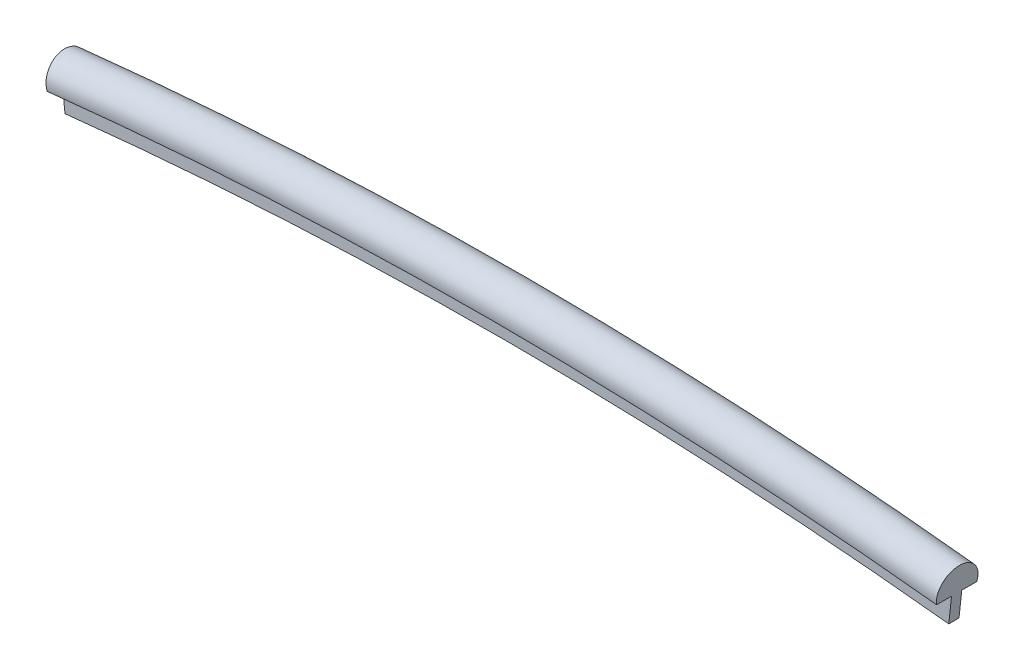
ISO-10303-21;
HEADER;
FILE_DESCRIPTION(('STEP AP214'),'2;1');
FILE_NAME('part.step','',(''),(''),'','','');
FILE_SCHEMA(('AUTOMOTIVE_DESIGN { 1 0 10303 214 1 1 1 1 }'));
ENDSEC;
DATA;
#1=APPLICATION_CONTEXT('core data for automotive mechanical design processes');
#2=APPLICATION_PROTOCOL_DEFINITION('international standard','automotive_design',2000,#1);
#3=PRODUCT_CONTEXT('',#1,'mechanical');
#4=PRODUCT('Part','Part','',(#3));
#5=PRODUCT_RELATED_PRODUCT_CATEGORY('part','',(#4));
#6=PRODUCT_DEFINITION_FORMATION('','',#4);
#7=PRODUCT_DEFINITION_CONTEXT('part definition',#1,'design');
#8=PRODUCT_DEFINITION('design','',#6,#7);
#9=PRODUCT_DEFINITION_SHAPE('','',#8);
#10=(LENGTH_UNIT() NAMED_UNIT(*) SI_UNIT(.MILLI.,.METRE.));
#11=(NAMED_UNIT(*) PLANE_ANGLE_UNIT() SI_UNIT($,.RADIAN.));
#12=(NAMED_UNIT(*) SI_UNIT($,.STERADIAN.) SOLID_ANGLE_UNIT());
#13=UNCERTAINTY_MEASURE_WITH_UNIT(LENGTH_MEASURE(1.E-05),#10,'distance_accuracy_value','');
#14=(GEOMETRIC_REPRESENTATION_CONTEXT(3) GLOBAL_UNCERTAINTY_ASSIGNED_CONTEXT((#13)) GLOBAL_UNIT_ASSIGNED_CONTEXT((#10,
#11,#12)) REPRESENTATION_CONTEXT('',''));
#15=CARTESIAN_POINT('',(0.,0.,0.));
#16=DIRECTION('',(0.,0.,1.));
#17=DIRECTION('',(1.,0.,0.));
#18=AXIS2_PLACEMENT_3D('',#15,#16,#17);
#19=CARTESIAN_POINT('',(0.,0.,70.5976415970385));
#20=DIRECTION('',(0.,0.,1.));
#21=DIRECTION('',(1.,0.,0.));
#22=AXIS2_PLACEMENT_3D('',#19,#20,#21);
#23=CYLINDRICAL_SURFACE('',#22,241.3);
#24=CARTESIAN_POINT('',(0.,0.,1.18));
#25=DIRECTION('',(0.,0.,1.));
#26=DIRECTION('',(1.,0.,0.));
#27=AXIS2_PLACEMENT_3D('',#24,#25,#26);
#28=CIRCLE('',#27,241.3);
#29=CARTESIAN_POINT('',(26.0690420080818,239.887671731544,1.18));
#30=VERTEX_POINT('',#29);
#31=CARTESIAN_POINT('',(-26.0690420080818,239.887671731544,1.18));
#32=VERTEX_POINT('',#31);
#33=EDGE_CURVE('E11',#30,#32,#28,.T.);
#34=ORIENTED_EDGE('',*,*,#33,.T.);
#35=DIRECTION('',(0.,0.,-1.));
#36=VECTOR('',#35,1.);
#37=CARTESIAN_POINT('',(-26.0690420080818,239.887671731544,1.18));
#38=LINE('',#37,#36);
#39=CARTESIAN_POINT('',(-26.0690420080818,239.887671731544,0.3));
#40=VERTEX_POINT('',#39);
#41=EDGE_CURVE('E103',#32,#40,#38,.T.);
#42=ORIENTED_EDGE('',*,*,#41,.T.);
#43=CARTESIAN_POINT('',(0.,0.,0.299999999999995));
#44=DIRECTION('',(0.,0.,1.));
#45=DIRECTION('',(1.,0.,0.));
#46=AXIS2_PLACEMENT_3D('',#43,#44,#45);
#47=CIRCLE('',#46,241.3);
#48=CARTESIAN_POINT('',(26.0690420080818,239.887671731544,0.3));
#49=VERTEX_POINT('',#48);
#50=EDGE_CURVE('E85',#49,#40,#47,.T.);
#51=ORIENTED_EDGE('',*,*,#50,.F.);
#52=DIRECTION('',(0.,0.,-1.));
#53=VECTOR('',#52,1.);
#54=CARTESIAN_POINT('',(26.0690420080818,239.887671731544,1.18));
#55=LINE('',#54,#53);
#56=EDGE_CURVE('E117',#30,#49,#55,.T.);
#57=ORIENTED_EDGE('',*,*,#56,.F.);
#58=EDGE_LOOP('',(#34,#42,#51,#57));
#59=FACE_BOUND('',#58,.T.);
#60=ADVANCED_FACE('F33',(#59),#23,.F.);
#61=CARTESIAN_POINT('',(0.,0.,0.));
#62=DIRECTION('',(0.,0.,1.));
#63=DIRECTION('',(1.,0.,0.));
#64=AXIS2_PLACEMENT_3D('',#61,#62,#63);
#65=TOROIDAL_SURFACE('',#64,241.586013989906,1.21416802890791);
#66=CARTESIAN_POINT('',(0.,0.,-1.18));
#67=DIRECTION('',(0.,0.,1.));
#68=DIRECTION('',(1.,0.,0.));
#69=AXIS2_PLACEMENT_3D('',#66,#67,#68);
#70=CIRCLE('',#69,241.3);
#71=CARTESIAN_POINT('',(26.0690420080818,239.887671731544,-1.18));
#72=VERTEX_POINT('',#71);
#73=CARTESIAN_POINT('',(-26.0690420080818,239.887671731544,-1.18));
#74=VERTEX_POINT('',#73);
#75=EDGE_CURVE('E41',#72,#74,#70,.T.);
#76=ORIENTED_EDGE('',*,*,#75,.T.);
#77=CARTESIAN_POINT('',(-26.0999417624032,240.172011682316,0.));
#78=DIRECTION('',(0.994147002617255,0.10803581437249,0.));
#79=DIRECTION('',(0.,0.,1.));
#80=AXIS2_PLACEMENT_3D('',#77,#78,#79);
#81=CIRCLE('',#80,1.21416802890791);
#82=EDGE_CURVE('E115',#74,#32,#81,.T.);
#83=ORIENTED_EDGE('',*,*,#82,.T.);
#84=ORIENTED_EDGE('',*,*,#33,.F.);
#85=CARTESIAN_POINT('',(26.0999417624032,240.172011682316,0.));
#86=DIRECTION('',(0.994147002617255,-0.10803581437249,0.));
#87=DIRECTION('',(0.,0.,1.));
#88=AXIS2_PLACEMENT_3D('',#85,#86,#87);
#89=CIRCLE('',#88,1.21416802890791);
#90=EDGE_CURVE('E97',#72,#30,#89,.T.);
#91=ORIENTED_EDGE('',*,*,#90,.F.);
#92=EDGE_LOOP('',(#76,#83,#84,#91));
#93=FACE_BOUND('',#92,.T.);
#94=ADVANCED_FACE('F35',(#93),#65,.T.);
#95=CARTESIAN_POINT('',(0.,0.,70.5976415970385));
#96=DIRECTION('',(0.,0.,1.));
#97=DIRECTION('',(1.,0.,0.));
#98=AXIS2_PLACEMENT_3D('',#95,#96,#97);
#99=CYLINDRICAL_SURFACE('',#98,241.3);
#100=CARTESIAN_POINT('',(0.,0.,-0.299999999999995));
#101=DIRECTION('',(0.,0.,1.));
#102=DIRECTION('',(1.,0.,0.));
#103=AXIS2_PLACEMENT_3D('',#100,#101,#102);
#104=CIRCLE('',#103,241.3);
#105=CARTESIAN_POINT('',(26.0690420080818,239.887671731544,-0.3));
#106=VERTEX_POINT('',#105);
#107=CARTESIAN_POINT('',(-26.0690420080818,239.887671731544,-0.3));
#108=VERTEX_POINT('',#107);
#109=EDGE_CURVE('E132',#106,#108,#104,.T.);
#110=ORIENTED_EDGE('',*,*,#109,.T.);
#111=DIRECTION('',(0.,0.,-1.));
#112=VECTOR('',#111,1.);
#113=CARTESIAN_POINT('',(-26.0690420080818,239.887671731544,-0.3));
#114=LINE('',#113,#112);
#115=EDGE_CURVE('E113',#108,#74,#114,.T.);
#116=ORIENTED_EDGE('',*,*,#115,.T.);
#117=ORIENTED_EDGE('',*,*,#75,.F.);
#118=DIRECTION('',(0.,0.,-1.));
#119=VECTOR('',#118,1.);
#120=CARTESIAN_POINT('',(26.0690420080818,239.887671731544,-0.3));
#121=LINE('',#120,#119);
#122=EDGE_CURVE('E125',#106,#72,#121,.T.);
#123=ORIENTED_EDGE('',*,*,#122,.F.);
#124=EDGE_LOOP('',(#110,#116,#117,#123));
#125=FACE_BOUND('',#124,.T.);
#126=ADVANCED_FACE('F134',(#125),#99,.F.);
#127=CARTESIAN_POINT('',(25.906988286523,238.396451227618,-0.3));
#128=DIRECTION('',(0.,0.,1.));
#129=DIRECTION('',(1.,0.,0.));
#130=AXIS2_PLACEMENT_3D('',#127,#128,#129);
#131=PLANE('',#130);
#132=CARTESIAN_POINT('',(0.,0.,-0.299999999999995));
#133=DIRECTION('',(0.,0.,1.));
#134=DIRECTION('',(1.,0.,0.));
#135=AXIS2_PLACEMENT_3D('',#132,#133,#134);
#136=CIRCLE('',#135,239.8);
#137=CARTESIAN_POINT('',(25.906988286523,238.396451227618,-0.3));
#138=VERTEX_POINT('',#137);
#139=CARTESIAN_POINT('',(-25.906988286523,238.396451227618,-0.3));
#140=VERTEX_POINT('',#139);
#141=EDGE_CURVE('E129',#138,#140,#136,.T.);
#142=ORIENTED_EDGE('',*,*,#141,.T.);
#143=DIRECTION('',(-0.10803581437249,0.994147002617255,0.));
#144=VECTOR('',#143,1.);
#145=CARTESIAN_POINT('',(-25.906988286523,238.396451227618,-0.3));
#146=LINE('',#145,#144);
#147=EDGE_CURVE('E110',#140,#108,#146,.T.);
#148=ORIENTED_EDGE('',*,*,#147,.T.);
#149=ORIENTED_EDGE('',*,*,#109,.F.);
#150=DIRECTION('',(0.10803581437249,0.994147002617255,0.));
#151=VECTOR('',#150,1.);
#152=CARTESIAN_POINT('',(25.906988286523,238.396451227618,-0.3));
#153=LINE('',#152,#151);
#154=EDGE_CURVE('E122',#138,#106,#153,.T.);
#155=ORIENTED_EDGE('',*,*,#154,.F.);
#156=EDGE_LOOP('',(#142,#148,#149,#155));
#157=FACE_BOUND('',#156,.T.);
#158=ADVANCED_FACE('F136',(#157),#131,.F.);
#159=CARTESIAN_POINT('',(0.,0.,70.5976415970385));
#160=DIRECTION('',(0.,0.,1.));
#161=DIRECTION('',(1.,0.,0.));
#162=AXIS2_PLACEMENT_3D('',#159,#160,#161);
#163=CYLINDRICAL_SURFACE('',#162,239.8);
#164=CARTESIAN_POINT('',(0.,0.,0.299999999999995));
#165=DIRECTION('',(0.,0.,1.));
#166=DIRECTION('',(1.,0.,0.));
#167=AXIS2_PLACEMENT_3D('',#164,#165,#166);
#168=CIRCLE('',#167,239.8);
#169=CARTESIAN_POINT('',(25.906988286523,238.396451227618,0.3));
#170=VERTEX_POINT('',#169);
#171=CARTESIAN_POINT('',(-25.906988286523,238.396451227618,0.3));
#172=VERTEX_POINT('',#171);
#173=EDGE_CURVE('E96',#170,#172,#168,.T.);
#174=ORIENTED_EDGE('',*,*,#173,.T.);
#175=DIRECTION('',(0.,0.,-1.));
#176=VECTOR('',#175,1.);
#177=CARTESIAN_POINT('',(-25.906988286523,238.396451227618,0.));
#178=LINE('',#177,#176);
#179=EDGE_CURVE('E105',#172,#140,#178,.T.);
#180=ORIENTED_EDGE('',*,*,#179,.T.);
#181=ORIENTED_EDGE('',*,*,#141,.F.);
#182=DIRECTION('',(0.,0.,-1.));
#183=VECTOR('',#182,1.);
#184=CARTESIAN_POINT('',(25.906988286523,238.396451227618,0.));
#185=LINE('',#184,#183);
#186=EDGE_CURVE('E120',#170,#138,#185,.T.);
#187=ORIENTED_EDGE('',*,*,#186,.F.);
#188=EDGE_LOOP('',(#174,#180,#181,#187));
#189=FACE_BOUND('',#188,.T.);
#190=ADVANCED_FACE('F141',(#189),#163,.F.);
#191=CARTESIAN_POINT('',(25.906988286523,238.396451227618,0.3));
#192=DIRECTION('',(0.,0.,-1.));
#193=DIRECTION('',(-1.,0.,0.));
#194=AXIS2_PLACEMENT_3D('',#191,#192,#193);
#195=PLANE('',#194);
#196=DIRECTION('',(-0.10803581437249,-0.994147002617255,0.));
#197=VECTOR('',#196,1.);
#198=CARTESIAN_POINT('',(25.906988286523,238.396451227618,0.3));
#199=LINE('',#198,#197);
#200=EDGE_CURVE('E91',#49,#170,#199,.T.);
#201=ORIENTED_EDGE('',*,*,#200,.F.);
#202=ORIENTED_EDGE('',*,*,#50,.T.);
#203=DIRECTION('',(0.10803581437249,-0.994147002617255,0.));
#204=VECTOR('',#203,1.);
#205=CARTESIAN_POINT('',(-25.906988286523,238.396451227618,0.3));
#206=LINE('',#205,#204);
#207=EDGE_CURVE('E88',#40,#172,#206,.T.);
#208=ORIENTED_EDGE('',*,*,#207,.T.);
#209=ORIENTED_EDGE('',*,*,#173,.F.);
#210=EDGE_LOOP('',(#201,#202,#208,#209));
#211=FACE_BOUND('',#210,.T.);
#212=ADVANCED_FACE('F87',(#211),#195,.F.);
#213=CARTESIAN_POINT('',(26.0999417624032,240.172011682316,0.));
#214=DIRECTION('',(-0.994147002617255,0.10803581437249,0.));
#215=DIRECTION('',(0.,0.,1.));
#216=AXIS2_PLACEMENT_3D('',#213,#214,#215);
#217=PLANE('',#216);
#218=ORIENTED_EDGE('',*,*,#56,.T.);
#219=ORIENTED_EDGE('',*,*,#200,.T.);
#220=ORIENTED_EDGE('',*,*,#186,.T.);
#221=ORIENTED_EDGE('',*,*,#154,.T.);
#222=ORIENTED_EDGE('',*,*,#122,.T.);
#223=ORIENTED_EDGE('',*,*,#90,.T.);
#224=EDGE_LOOP('',(#218,#219,#220,#221,#222,#223));
#225=FACE_BOUND('',#224,.T.);
#226=ADVANCED_FACE('F143',(#225),#217,.F.);
#227=CARTESIAN_POINT('',(-26.0999417624032,240.172011682316,0.));
#228=DIRECTION('',(-0.994147002617255,-0.10803581437249,0.));
#229=DIRECTION('',(0.,0.,1.));
#230=AXIS2_PLACEMENT_3D('',#227,#228,#229);
#231=PLANE('',#230);
#232=ORIENTED_EDGE('',*,*,#41,.F.);
#233=ORIENTED_EDGE('',*,*,#82,.F.);
#234=ORIENTED_EDGE('',*,*,#115,.F.);
#235=ORIENTED_EDGE('',*,*,#147,.F.);
#236=ORIENTED_EDGE('',*,*,#179,.F.);
#237=ORIENTED_EDGE('',*,*,#207,.F.);
#238=EDGE_LOOP('',(#232,#233,#234,#235,#236,#237));
#239=FACE_BOUND('',#238,.T.);
#240=ADVANCED_FACE('F101',(#239),#231,.T.);
#241=CLOSED_SHELL('',(#60,#94,#126,#158,#190,#212,#226,#240));
#242=MANIFOLD_SOLID_BREP('B2',#241);
#243=ADVANCED_BREP_SHAPE_REPRESENTATION('',(#18,#242),#14);
#244=SHAPE_DEFINITION_REPRESENTATION(#9,#243);
ENDSEC;
END-ISO-10303-21;
